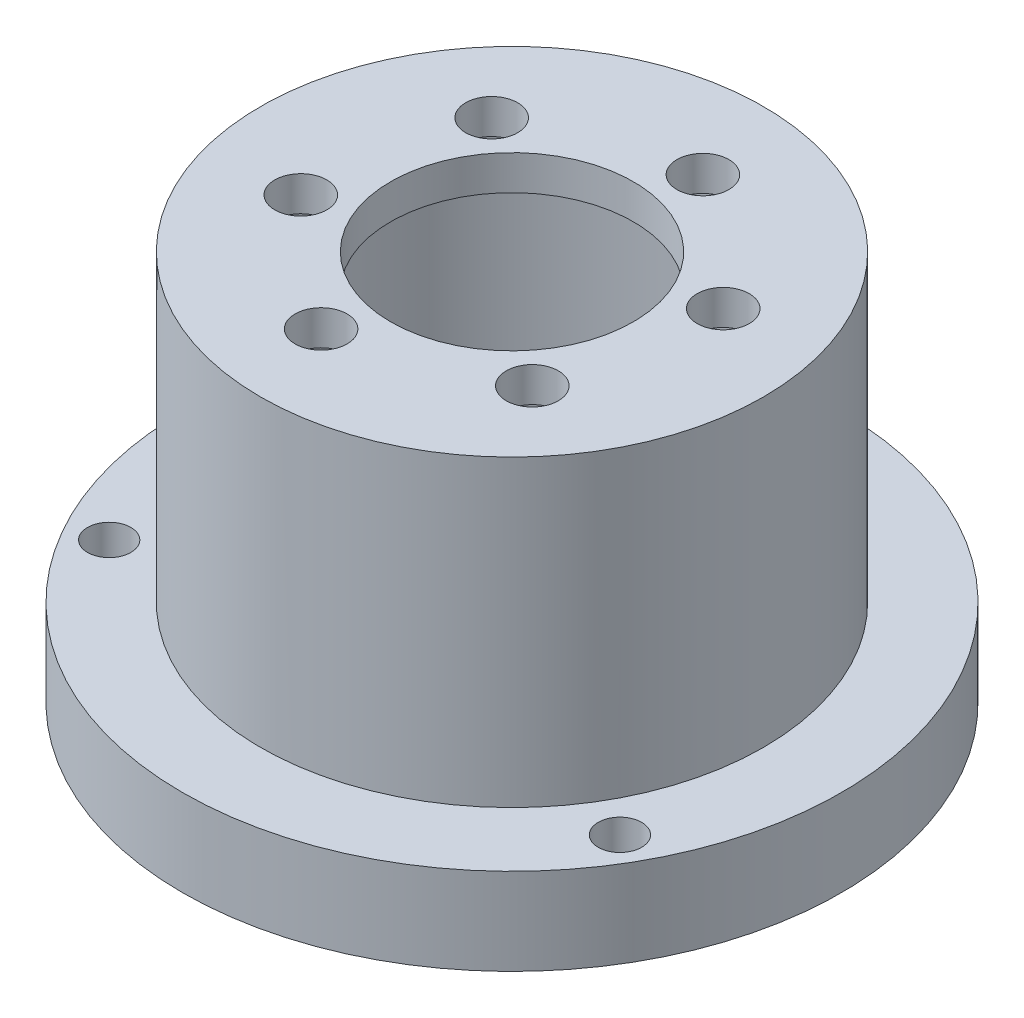
ISO-10303-21;
HEADER;
FILE_DESCRIPTION(('STEP AP214'),'2;1');
FILE_NAME('part.step','',(''),(''),'','','');
FILE_SCHEMA(('AUTOMOTIVE_DESIGN { 1 0 10303 214 1 1 1 1 }'));
ENDSEC;
DATA;
#1=APPLICATION_CONTEXT('core data for automotive mechanical design processes');
#2=APPLICATION_PROTOCOL_DEFINITION('international standard','automotive_design',2000,#1);
#3=PRODUCT_CONTEXT('',#1,'mechanical');
#4=PRODUCT('Part','Part','',(#3));
#5=PRODUCT_RELATED_PRODUCT_CATEGORY('part','',(#4));
#6=PRODUCT_DEFINITION_FORMATION('','',#4);
#7=PRODUCT_DEFINITION_CONTEXT('part definition',#1,'design');
#8=PRODUCT_DEFINITION('design','',#6,#7);
#9=PRODUCT_DEFINITION_SHAPE('','',#8);
#10=(LENGTH_UNIT() NAMED_UNIT(*) SI_UNIT(.MILLI.,.METRE.));
#11=(NAMED_UNIT(*) PLANE_ANGLE_UNIT() SI_UNIT($,.RADIAN.));
#12=(NAMED_UNIT(*) SI_UNIT($,.STERADIAN.) SOLID_ANGLE_UNIT());
#13=UNCERTAINTY_MEASURE_WITH_UNIT(LENGTH_MEASURE(1.E-05),#10,'distance_accuracy_value','');
#14=(GEOMETRIC_REPRESENTATION_CONTEXT(3) GLOBAL_UNCERTAINTY_ASSIGNED_CONTEXT((#13)) GLOBAL_UNIT_ASSIGNED_CONTEXT((#10,
#11,#12)) REPRESENTATION_CONTEXT('',''));
#15=CARTESIAN_POINT('',(0.,0.,0.));
#16=DIRECTION('',(0.,0.,1.));
#17=DIRECTION('',(1.,0.,0.));
#18=AXIS2_PLACEMENT_3D('',#15,#16,#17);
#19=CARTESIAN_POINT('',(0.,5.,0.));
#20=DIRECTION('',(0.,1.,0.));
#21=DIRECTION('',(0.,0.,1.));
#22=AXIS2_PLACEMENT_3D('',#19,#20,#21);
#23=PLANE('',#22);
#24=CARTESIAN_POINT('',(0.,5.,0.));
#25=DIRECTION('',(0.,1.,0.));
#26=DIRECTION('',(1.,0.,0.));
#27=AXIS2_PLACEMENT_3D('',#24,#25,#26);
#28=CIRCLE('',#27,14.5);
#29=CARTESIAN_POINT('',(14.5,5.,0.));
#30=VERTEX_POINT('',#29);
#31=EDGE_CURVE('E11',#30,#30,#28,.T.);
#32=ORIENTED_EDGE('',*,*,#31,.F.);
#33=EDGE_LOOP('',(#32));
#34=FACE_BOUND('',#33,.T.);
#35=CARTESIAN_POINT('',(14.7224318643355,5.,8.5));
#36=DIRECTION('',(0.,1.,0.));
#37=DIRECTION('',(0.,0.,1.));
#38=AXIS2_PLACEMENT_3D('',#35,#36,#37);
#39=CIRCLE('',#38,1.25);
#40=CARTESIAN_POINT('',(14.7224318643355,5.,9.75));
#41=VERTEX_POINT('',#40);
#42=EDGE_CURVE('E74',#41,#41,#39,.T.);
#43=ORIENTED_EDGE('',*,*,#42,.F.);
#44=EDGE_LOOP('',(#43));
#45=FACE_BOUND('',#44,.T.);
#46=CARTESIAN_POINT('',(0.,5.,0.));
#47=DIRECTION('',(0.,1.,0.));
#48=DIRECTION('',(0.,0.,1.));
#49=AXIS2_PLACEMENT_3D('',#46,#47,#48);
#50=CIRCLE('',#49,19.);
#51=CARTESIAN_POINT('',(0.,5.,19.));
#52=VERTEX_POINT('',#51);
#53=EDGE_CURVE('E58',#52,#52,#50,.T.);
#54=ORIENTED_EDGE('',*,*,#53,.T.);
#55=EDGE_LOOP('',(#54));
#56=FACE_BOUND('',#55,.T.);
#57=CARTESIAN_POINT('',(0.,5.,-17.));
#58=DIRECTION('',(0.,1.,0.));
#59=DIRECTION('',(0.,0.,1.));
#60=AXIS2_PLACEMENT_3D('',#57,#58,#59);
#61=CIRCLE('',#60,1.25);
#62=CARTESIAN_POINT('',(0.,5.,-15.75));
#63=VERTEX_POINT('',#62);
#64=EDGE_CURVE('E80',#63,#63,#61,.T.);
#65=ORIENTED_EDGE('',*,*,#64,.F.);
#66=EDGE_LOOP('',(#65));
#67=FACE_BOUND('',#66,.T.);
#68=CARTESIAN_POINT('',(-14.7224318643355,5.,8.50000000000001));
#69=DIRECTION('',(0.,1.,0.));
#70=DIRECTION('',(0.,0.,1.));
#71=AXIS2_PLACEMENT_3D('',#68,#69,#70);
#72=CIRCLE('',#71,1.25);
#73=CARTESIAN_POINT('',(-14.7224318643355,5.,9.75000000000001));
#74=VERTEX_POINT('',#73);
#75=EDGE_CURVE('E67',#74,#74,#72,.T.);
#76=ORIENTED_EDGE('',*,*,#75,.F.);
#77=EDGE_LOOP('',(#76));
#78=FACE_BOUND('',#77,.T.);
#79=ADVANCED_FACE('F50',(#34,#45,#56,#67,#78),#23,.T.);
#80=CARTESIAN_POINT('',(0.,0.,0.));
#81=DIRECTION('',(0.,1.,0.));
#82=DIRECTION('',(0.,0.,1.));
#83=AXIS2_PLACEMENT_3D('',#80,#81,#82);
#84=PLANE('',#83);
#85=CARTESIAN_POINT('',(0.,0.,0.));
#86=DIRECTION('',(0.,1.,0.));
#87=DIRECTION('',(0.,0.,1.));
#88=AXIS2_PLACEMENT_3D('',#85,#86,#87);
#89=CIRCLE('',#88,19.);
#90=CARTESIAN_POINT('',(0.,0.,19.));
#91=VERTEX_POINT('',#90);
#92=EDGE_CURVE('E54',#91,#91,#89,.T.);
#93=ORIENTED_EDGE('',*,*,#92,.F.);
#94=EDGE_LOOP('',(#93));
#95=FACE_BOUND('',#94,.T.);
#96=CARTESIAN_POINT('',(0.,0.,0.));
#97=DIRECTION('',(0.,1.,0.));
#98=DIRECTION('',(0.,0.,1.));
#99=AXIS2_PLACEMENT_3D('',#96,#97,#98);
#100=CIRCLE('',#99,13.);
#101=CARTESIAN_POINT('',(0.,0.,13.));
#102=VERTEX_POINT('',#101);
#103=EDGE_CURVE('E83',#102,#102,#100,.T.);
#104=ORIENTED_EDGE('',*,*,#103,.T.);
#105=EDGE_LOOP('',(#104));
#106=FACE_BOUND('',#105,.T.);
#107=CARTESIAN_POINT('',(0.,0.,-17.));
#108=DIRECTION('',(0.,1.,0.));
#109=DIRECTION('',(0.,0.,1.));
#110=AXIS2_PLACEMENT_3D('',#107,#108,#109);
#111=CIRCLE('',#110,1.25);
#112=CARTESIAN_POINT('',(0.,0.,-15.75));
#113=VERTEX_POINT('',#112);
#114=EDGE_CURVE('E77',#113,#113,#111,.T.);
#115=ORIENTED_EDGE('',*,*,#114,.T.);
#116=EDGE_LOOP('',(#115));
#117=FACE_BOUND('',#116,.T.);
#118=CARTESIAN_POINT('',(14.7224318643355,0.,8.5));
#119=DIRECTION('',(0.,1.,0.));
#120=DIRECTION('',(0.,0.,1.));
#121=AXIS2_PLACEMENT_3D('',#118,#119,#120);
#122=CIRCLE('',#121,1.25);
#123=CARTESIAN_POINT('',(14.7224318643355,0.,9.75));
#124=VERTEX_POINT('',#123);
#125=EDGE_CURVE('E70',#124,#124,#122,.T.);
#126=ORIENTED_EDGE('',*,*,#125,.T.);
#127=EDGE_LOOP('',(#126));
#128=FACE_BOUND('',#127,.T.);
#129=CARTESIAN_POINT('',(-14.7224318643355,0.,8.50000000000001));
#130=DIRECTION('',(0.,1.,0.));
#131=DIRECTION('',(0.,0.,1.));
#132=AXIS2_PLACEMENT_3D('',#129,#130,#131);
#133=CIRCLE('',#132,1.25);
#134=CARTESIAN_POINT('',(-14.7224318643355,0.,9.75000000000001));
#135=VERTEX_POINT('',#134);
#136=EDGE_CURVE('E71',#135,#135,#133,.T.);
#137=ORIENTED_EDGE('',*,*,#136,.T.);
#138=EDGE_LOOP('',(#137));
#139=FACE_BOUND('',#138,.T.);
#140=ADVANCED_FACE('F93',(#95,#106,#117,#128,#139),#84,.F.);
#141=CARTESIAN_POINT('',(0.,5.,0.));
#142=DIRECTION('',(0.,-1.,0.));
#143=DIRECTION('',(0.,0.,-1.));
#144=AXIS2_PLACEMENT_3D('',#141,#142,#143);
#145=CYLINDRICAL_SURFACE('',#144,19.);
#146=ORIENTED_EDGE('',*,*,#53,.F.);
#147=EDGE_LOOP('',(#146));
#148=FACE_BOUND('',#147,.T.);
#149=ORIENTED_EDGE('',*,*,#92,.T.);
#150=EDGE_LOOP('',(#149));
#151=FACE_BOUND('',#150,.T.);
#152=ADVANCED_FACE('F52',(#148,#151),#145,.T.);
#153=CARTESIAN_POINT('',(0.,5.,0.));
#154=DIRECTION('',(0.,-1.,0.));
#155=DIRECTION('',(0.,0.,-1.));
#156=AXIS2_PLACEMENT_3D('',#153,#154,#155);
#157=CYLINDRICAL_SURFACE('',#156,13.);
#158=ORIENTED_EDGE('',*,*,#103,.F.);
#159=EDGE_LOOP('',(#158));
#160=FACE_BOUND('',#159,.T.);
#161=CARTESIAN_POINT('',(0.,20.5,0.));
#162=DIRECTION('',(0.,1.,0.));
#163=DIRECTION('',(0.,0.,1.));
#164=AXIS2_PLACEMENT_3D('',#161,#162,#163);
#165=CIRCLE('',#164,13.);
#166=CARTESIAN_POINT('',(0.,20.5,13.));
#167=VERTEX_POINT('',#166);
#168=EDGE_CURVE('E65',#167,#167,#165,.T.);
#169=ORIENTED_EDGE('',*,*,#168,.T.);
#170=EDGE_LOOP('',(#169));
#171=FACE_BOUND('',#170,.T.);
#172=ADVANCED_FACE('F124',(#160,#171),#157,.F.);
#173=CARTESIAN_POINT('',(0.,5.,-17.));
#174=DIRECTION('',(0.,-1.,0.));
#175=DIRECTION('',(0.,0.,-1.));
#176=AXIS2_PLACEMENT_3D('',#173,#174,#175);
#177=CYLINDRICAL_SURFACE('',#176,1.25);
#178=ORIENTED_EDGE('',*,*,#64,.T.);
#179=EDGE_LOOP('',(#178));
#180=FACE_BOUND('',#179,.T.);
#181=ORIENTED_EDGE('',*,*,#114,.F.);
#182=EDGE_LOOP('',(#181));
#183=FACE_BOUND('',#182,.T.);
#184=ADVANCED_FACE('F114',(#180,#183),#177,.F.);
#185=CARTESIAN_POINT('',(14.7224318643355,5.,8.5));
#186=DIRECTION('',(0.,-1.,0.));
#187=DIRECTION('',(0.,0.,-1.));
#188=AXIS2_PLACEMENT_3D('',#185,#186,#187);
#189=CYLINDRICAL_SURFACE('',#188,1.25);
#190=ORIENTED_EDGE('',*,*,#42,.T.);
#191=EDGE_LOOP('',(#190));
#192=FACE_BOUND('',#191,.T.);
#193=ORIENTED_EDGE('',*,*,#125,.F.);
#194=EDGE_LOOP('',(#193));
#195=FACE_BOUND('',#194,.T.);
#196=ADVANCED_FACE('F105',(#192,#195),#189,.F.);
#197=CARTESIAN_POINT('',(-14.7224318643355,5.,8.50000000000001));
#198=DIRECTION('',(0.,-1.,0.));
#199=DIRECTION('',(0.,0.,-1.));
#200=AXIS2_PLACEMENT_3D('',#197,#198,#199);
#201=CYLINDRICAL_SURFACE('',#200,1.25);
#202=ORIENTED_EDGE('',*,*,#75,.T.);
#203=EDGE_LOOP('',(#202));
#204=FACE_BOUND('',#203,.T.);
#205=ORIENTED_EDGE('',*,*,#136,.F.);
#206=EDGE_LOOP('',(#205));
#207=FACE_BOUND('',#206,.T.);
#208=ADVANCED_FACE('F102',(#204,#207),#201,.F.);
#209=CARTESIAN_POINT('',(0.,20.5,0.));
#210=DIRECTION('',(0.,-1.,0.));
#211=DIRECTION('',(0.,0.,-1.));
#212=AXIS2_PLACEMENT_3D('',#209,#210,#211);
#213=CYLINDRICAL_SURFACE('',#212,14.5);
#214=ORIENTED_EDGE('',*,*,#31,.T.);
#215=EDGE_LOOP('',(#214));
#216=FACE_BOUND('',#215,.T.);
#217=CARTESIAN_POINT('',(0.,22.5,0.));
#218=DIRECTION('',(0.,1.,0.));
#219=DIRECTION('',(0.,0.,1.));
#220=AXIS2_PLACEMENT_3D('',#217,#218,#219);
#221=CIRCLE('',#220,14.5);
#222=CARTESIAN_POINT('',(0.,22.5,14.5));
#223=VERTEX_POINT('',#222);
#224=EDGE_CURVE('E351',#223,#223,#221,.T.);
#225=ORIENTED_EDGE('',*,*,#224,.F.);
#226=EDGE_LOOP('',(#225));
#227=FACE_BOUND('',#226,.T.);
#228=ADVANCED_FACE('F104',(#216,#227),#213,.T.);
#229=CARTESIAN_POINT('',(0.,20.5,0.));
#230=DIRECTION('',(0.,1.,0.));
#231=DIRECTION('',(0.,0.,1.));
#232=AXIS2_PLACEMENT_3D('',#229,#230,#231);
#233=PLANE('',#232);
#234=CARTESIAN_POINT('',(1.64965768783577,20.5,-9.35567365361599));
#235=DIRECTION('',(0.,1.,0.));
#236=DIRECTION('',(0.,0.,1.));
#237=AXIS2_PLACEMENT_3D('',#234,#235,#236);
#238=CIRCLE('',#237,1.5);
#239=CARTESIAN_POINT('',(1.64965768783577,20.5,-7.85567365361599));
#240=VERTEX_POINT('',#239);
#241=EDGE_CURVE('E375',#240,#240,#238,.T.);
#242=ORIENTED_EDGE('',*,*,#241,.T.);
#243=EDGE_LOOP('',(#242));
#244=FACE_BOUND('',#243,.T.);
#245=CARTESIAN_POINT('',(8.92707989746611,20.5,-3.24919136159392));
#246=DIRECTION('',(0.,1.,0.));
#247=DIRECTION('',(0.,0.,1.));
#248=AXIS2_PLACEMENT_3D('',#245,#246,#247);
#249=CIRCLE('',#248,1.5);
#250=CARTESIAN_POINT('',(8.92707989746611,20.5,-1.74919136159391));
#251=VERTEX_POINT('',#250);
#252=EDGE_CURVE('E373',#251,#251,#249,.T.);
#253=ORIENTED_EDGE('',*,*,#252,.T.);
#254=EDGE_LOOP('',(#253));
#255=FACE_BOUND('',#254,.T.);
#256=CARTESIAN_POINT('',(7.27742220963034,20.5,6.10648229202207));
#257=DIRECTION('',(0.,1.,0.));
#258=DIRECTION('',(0.,0.,1.));
#259=AXIS2_PLACEMENT_3D('',#256,#257,#258);
#260=CIRCLE('',#259,1.50000000000005);
#261=CARTESIAN_POINT('',(7.27742220963034,20.5,7.60648229202212));
#262=VERTEX_POINT('',#261);
#263=EDGE_CURVE('E370',#262,#262,#260,.T.);
#264=ORIENTED_EDGE('',*,*,#263,.T.);
#265=EDGE_LOOP('',(#264));
#266=FACE_BOUND('',#265,.T.);
#267=CARTESIAN_POINT('',(-1.64965768783577,20.5,9.35567365361599));
#268=DIRECTION('',(0.,1.,0.));
#269=DIRECTION('',(0.,0.,1.));
#270=AXIS2_PLACEMENT_3D('',#267,#268,#269);
#271=CIRCLE('',#270,1.5);
#272=CARTESIAN_POINT('',(-1.64965768783577,20.5,10.855673653616));
#273=VERTEX_POINT('',#272);
#274=EDGE_CURVE('E367',#273,#273,#271,.T.);
#275=ORIENTED_EDGE('',*,*,#274,.T.);
#276=EDGE_LOOP('',(#275));
#277=FACE_BOUND('',#276,.T.);
#278=CARTESIAN_POINT('',(-8.92707989746611,20.5,3.24919136159392));
#279=DIRECTION('',(0.,1.,0.));
#280=DIRECTION('',(0.,0.,1.));
#281=AXIS2_PLACEMENT_3D('',#278,#279,#280);
#282=CIRCLE('',#281,1.5);
#283=CARTESIAN_POINT('',(-8.92707989746611,20.5,4.74919136159392));
#284=VERTEX_POINT('',#283);
#285=EDGE_CURVE('E364',#284,#284,#282,.T.);
#286=ORIENTED_EDGE('',*,*,#285,.T.);
#287=EDGE_LOOP('',(#286));
#288=FACE_BOUND('',#287,.T.);
#289=CARTESIAN_POINT('',(-7.27742220963033,20.5,-6.10648229202207));
#290=DIRECTION('',(0.,1.,0.));
#291=DIRECTION('',(0.,0.,1.));
#292=AXIS2_PLACEMENT_3D('',#289,#290,#291);
#293=CIRCLE('',#292,1.5);
#294=CARTESIAN_POINT('',(-7.27742220963033,20.5,-4.60648229202208));
#295=VERTEX_POINT('',#294);
#296=EDGE_CURVE('E361',#295,#295,#293,.T.);
#297=ORIENTED_EDGE('',*,*,#296,.T.);
#298=EDGE_LOOP('',(#297));
#299=FACE_BOUND('',#298,.T.);
#300=CARTESIAN_POINT('',(0.,20.5,0.));
#301=DIRECTION('',(0.,1.,0.));
#302=DIRECTION('',(0.,0.,1.));
#303=AXIS2_PLACEMENT_3D('',#300,#301,#302);
#304=CIRCLE('',#303,7.);
#305=CARTESIAN_POINT('',(0.,20.5,7.));
#306=VERTEX_POINT('',#305);
#307=EDGE_CURVE('E358',#306,#306,#304,.T.);
#308=ORIENTED_EDGE('',*,*,#307,.T.);
#309=EDGE_LOOP('',(#308));
#310=FACE_BOUND('',#309,.T.);
#311=ORIENTED_EDGE('',*,*,#168,.F.);
#312=EDGE_LOOP('',(#311));
#313=FACE_BOUND('',#312,.T.);
#314=ADVANCED_FACE('F112',(#244,#255,#266,#277,#288,#299,#310,#313),#233,.F.);
#315=CARTESIAN_POINT('',(1.64965768783577,22.5,-9.35567365361599));
#316=DIRECTION('',(0.,-1.,0.));
#317=DIRECTION('',(0.,0.,-1.));
#318=AXIS2_PLACEMENT_3D('',#315,#316,#317);
#319=CYLINDRICAL_SURFACE('',#318,1.5);
#320=CARTESIAN_POINT('',(1.64965768783577,22.5,-9.35567365361599));
#321=DIRECTION('',(0.,1.,0.));
#322=DIRECTION('',(0.,0.,1.));
#323=AXIS2_PLACEMENT_3D('',#320,#321,#322);
#324=CIRCLE('',#323,1.5);
#325=CARTESIAN_POINT('',(1.64965768783577,22.5,-7.85567365361599));
#326=VERTEX_POINT('',#325);
#327=EDGE_CURVE('E348',#326,#326,#324,.T.);
#328=ORIENTED_EDGE('',*,*,#327,.T.);
#329=EDGE_LOOP('',(#328));
#330=FACE_BOUND('',#329,.T.);
#331=ORIENTED_EDGE('',*,*,#241,.F.);
#332=EDGE_LOOP('',(#331));
#333=FACE_BOUND('',#332,.T.);
#334=ADVANCED_FACE('F180',(#330,#333),#319,.F.);
#335=CARTESIAN_POINT('',(8.92707989746611,22.5,-3.24919136159392));
#336=DIRECTION('',(0.,-1.,0.));
#337=DIRECTION('',(0.,0.,-1.));
#338=AXIS2_PLACEMENT_3D('',#335,#336,#337);
#339=CYLINDRICAL_SURFACE('',#338,1.5);
#340=CARTESIAN_POINT('',(8.92707989746611,22.5,-3.24919136159392));
#341=DIRECTION('',(0.,1.,0.));
#342=DIRECTION('',(0.,0.,1.));
#343=AXIS2_PLACEMENT_3D('',#340,#341,#342);
#344=CIRCLE('',#343,1.5);
#345=CARTESIAN_POINT('',(8.92707989746611,22.5,-1.74919136159391));
#346=VERTEX_POINT('',#345);
#347=EDGE_CURVE('E344',#346,#346,#344,.T.);
#348=ORIENTED_EDGE('',*,*,#347,.T.);
#349=EDGE_LOOP('',(#348));
#350=FACE_BOUND('',#349,.T.);
#351=ORIENTED_EDGE('',*,*,#252,.F.);
#352=EDGE_LOOP('',(#351));
#353=FACE_BOUND('',#352,.T.);
#354=ADVANCED_FACE('F190',(#350,#353),#339,.F.);
#355=CARTESIAN_POINT('',(7.27742220963034,22.5,6.10648229202207));
#356=DIRECTION('',(0.,-1.,0.));
#357=DIRECTION('',(0.,0.,-1.));
#358=AXIS2_PLACEMENT_3D('',#355,#356,#357);
#359=CYLINDRICAL_SURFACE('',#358,1.50000000000005);
#360=CARTESIAN_POINT('',(7.27742220963034,22.5,6.10648229202207));
#361=DIRECTION('',(0.,1.,0.));
#362=DIRECTION('',(0.,0.,1.));
#363=AXIS2_PLACEMENT_3D('',#360,#361,#362);
#364=CIRCLE('',#363,1.50000000000005);
#365=CARTESIAN_POINT('',(7.27742220963034,22.5,7.60648229202212));
#366=VERTEX_POINT('',#365);
#367=EDGE_CURVE('E340',#366,#366,#364,.T.);
#368=ORIENTED_EDGE('',*,*,#367,.T.);
#369=EDGE_LOOP('',(#368));
#370=FACE_BOUND('',#369,.T.);
#371=ORIENTED_EDGE('',*,*,#263,.F.);
#372=EDGE_LOOP('',(#371));
#373=FACE_BOUND('',#372,.T.);
#374=ADVANCED_FACE('F201',(#370,#373),#359,.F.);
#375=CARTESIAN_POINT('',(-1.64965768783577,22.5,9.35567365361599));
#376=DIRECTION('',(0.,-1.,0.));
#377=DIRECTION('',(0.,0.,-1.));
#378=AXIS2_PLACEMENT_3D('',#375,#376,#377);
#379=CYLINDRICAL_SURFACE('',#378,1.5);
#380=CARTESIAN_POINT('',(-1.64965768783577,22.5,9.35567365361599));
#381=DIRECTION('',(0.,1.,0.));
#382=DIRECTION('',(0.,0.,1.));
#383=AXIS2_PLACEMENT_3D('',#380,#381,#382);
#384=CIRCLE('',#383,1.5);
#385=CARTESIAN_POINT('',(-1.64965768783577,22.5,10.855673653616));
#386=VERTEX_POINT('',#385);
#387=EDGE_CURVE('E336',#386,#386,#384,.T.);
#388=ORIENTED_EDGE('',*,*,#387,.T.);
#389=EDGE_LOOP('',(#388));
#390=FACE_BOUND('',#389,.T.);
#391=ORIENTED_EDGE('',*,*,#274,.F.);
#392=EDGE_LOOP('',(#391));
#393=FACE_BOUND('',#392,.T.);
#394=ADVANCED_FACE('F212',(#390,#393),#379,.F.);
#395=CARTESIAN_POINT('',(-8.92707989746611,22.5,3.24919136159392));
#396=DIRECTION('',(0.,-1.,0.));
#397=DIRECTION('',(0.,0.,-1.));
#398=AXIS2_PLACEMENT_3D('',#395,#396,#397);
#399=CYLINDRICAL_SURFACE('',#398,1.5);
#400=CARTESIAN_POINT('',(-8.92707989746611,22.5,3.24919136159392));
#401=DIRECTION('',(0.,1.,0.));
#402=DIRECTION('',(0.,0.,1.));
#403=AXIS2_PLACEMENT_3D('',#400,#401,#402);
#404=CIRCLE('',#403,1.5);
#405=CARTESIAN_POINT('',(-8.92707989746611,22.5,4.74919136159392));
#406=VERTEX_POINT('',#405);
#407=EDGE_CURVE('E332',#406,#406,#404,.T.);
#408=ORIENTED_EDGE('',*,*,#407,.T.);
#409=EDGE_LOOP('',(#408));
#410=FACE_BOUND('',#409,.T.);
#411=ORIENTED_EDGE('',*,*,#285,.F.);
#412=EDGE_LOOP('',(#411));
#413=FACE_BOUND('',#412,.T.);
#414=ADVANCED_FACE('F223',(#410,#413),#399,.F.);
#415=CARTESIAN_POINT('',(-7.27742220963033,22.5,-6.10648229202207));
#416=DIRECTION('',(0.,-1.,0.));
#417=DIRECTION('',(0.,0.,-1.));
#418=AXIS2_PLACEMENT_3D('',#415,#416,#417);
#419=CYLINDRICAL_SURFACE('',#418,1.5);
#420=CARTESIAN_POINT('',(-7.27742220963033,22.5,-6.10648229202207));
#421=DIRECTION('',(0.,1.,0.));
#422=DIRECTION('',(0.,0.,1.));
#423=AXIS2_PLACEMENT_3D('',#420,#421,#422);
#424=CIRCLE('',#423,1.5);
#425=CARTESIAN_POINT('',(-7.27742220963033,22.5,-4.60648229202208));
#426=VERTEX_POINT('',#425);
#427=EDGE_CURVE('E328',#426,#426,#424,.T.);
#428=ORIENTED_EDGE('',*,*,#427,.T.);
#429=EDGE_LOOP('',(#428));
#430=FACE_BOUND('',#429,.T.);
#431=ORIENTED_EDGE('',*,*,#296,.F.);
#432=EDGE_LOOP('',(#431));
#433=FACE_BOUND('',#432,.T.);
#434=ADVANCED_FACE('F234',(#430,#433),#419,.F.);
#435=CARTESIAN_POINT('',(0.,22.5,0.));
#436=DIRECTION('',(0.,-1.,0.));
#437=DIRECTION('',(0.,0.,-1.));
#438=AXIS2_PLACEMENT_3D('',#435,#436,#437);
#439=CYLINDRICAL_SURFACE('',#438,7.);
#440=CARTESIAN_POINT('',(0.,22.5,0.));
#441=DIRECTION('',(0.,1.,0.));
#442=DIRECTION('',(0.,0.,1.));
#443=AXIS2_PLACEMENT_3D('',#440,#441,#442);
#444=CIRCLE('',#443,7.);
#445=CARTESIAN_POINT('',(0.,22.5,7.));
#446=VERTEX_POINT('',#445);
#447=EDGE_CURVE('E324',#446,#446,#444,.T.);
#448=ORIENTED_EDGE('',*,*,#447,.T.);
#449=EDGE_LOOP('',(#448));
#450=FACE_BOUND('',#449,.T.);
#451=ORIENTED_EDGE('',*,*,#307,.F.);
#452=EDGE_LOOP('',(#451));
#453=FACE_BOUND('',#452,.T.);
#454=ADVANCED_FACE('F245',(#450,#453),#439,.F.);
#455=CARTESIAN_POINT('',(0.,22.5,0.));
#456=DIRECTION('',(0.,1.,0.));
#457=DIRECTION('',(0.,0.,1.));
#458=AXIS2_PLACEMENT_3D('',#455,#456,#457);
#459=PLANE('',#458);
#460=ORIENTED_EDGE('',*,*,#447,.F.);
#461=EDGE_LOOP('',(#460));
#462=FACE_BOUND('',#461,.T.);
#463=ORIENTED_EDGE('',*,*,#427,.F.);
#464=EDGE_LOOP('',(#463));
#465=FACE_BOUND('',#464,.T.);
#466=ORIENTED_EDGE('',*,*,#407,.F.);
#467=EDGE_LOOP('',(#466));
#468=FACE_BOUND('',#467,.T.);
#469=ORIENTED_EDGE('',*,*,#387,.F.);
#470=EDGE_LOOP('',(#469));
#471=FACE_BOUND('',#470,.T.);
#472=ORIENTED_EDGE('',*,*,#367,.F.);
#473=EDGE_LOOP('',(#472));
#474=FACE_BOUND('',#473,.T.);
#475=ORIENTED_EDGE('',*,*,#347,.F.);
#476=EDGE_LOOP('',(#475));
#477=FACE_BOUND('',#476,.T.);
#478=ORIENTED_EDGE('',*,*,#327,.F.);
#479=EDGE_LOOP('',(#478));
#480=FACE_BOUND('',#479,.T.);
#481=ORIENTED_EDGE('',*,*,#224,.T.);
#482=EDGE_LOOP('',(#481));
#483=FACE_BOUND('',#482,.T.);
#484=ADVANCED_FACE('F256',(#462,#465,#468,#471,#474,#477,#480,#483),#459,.T.);
#485=CLOSED_SHELL('',(#79,#140,#152,#172,#184,#196,#208,#228,#314,#334,#354,#374,#394,#414,#434,
#454,#484));
#486=MANIFOLD_SOLID_BREP('B2',#485);
#487=ADVANCED_BREP_SHAPE_REPRESENTATION('',(#18,#486),#14);
#488=SHAPE_DEFINITION_REPRESENTATION(#9,#487);
ENDSEC;
END-ISO-10303-21;
